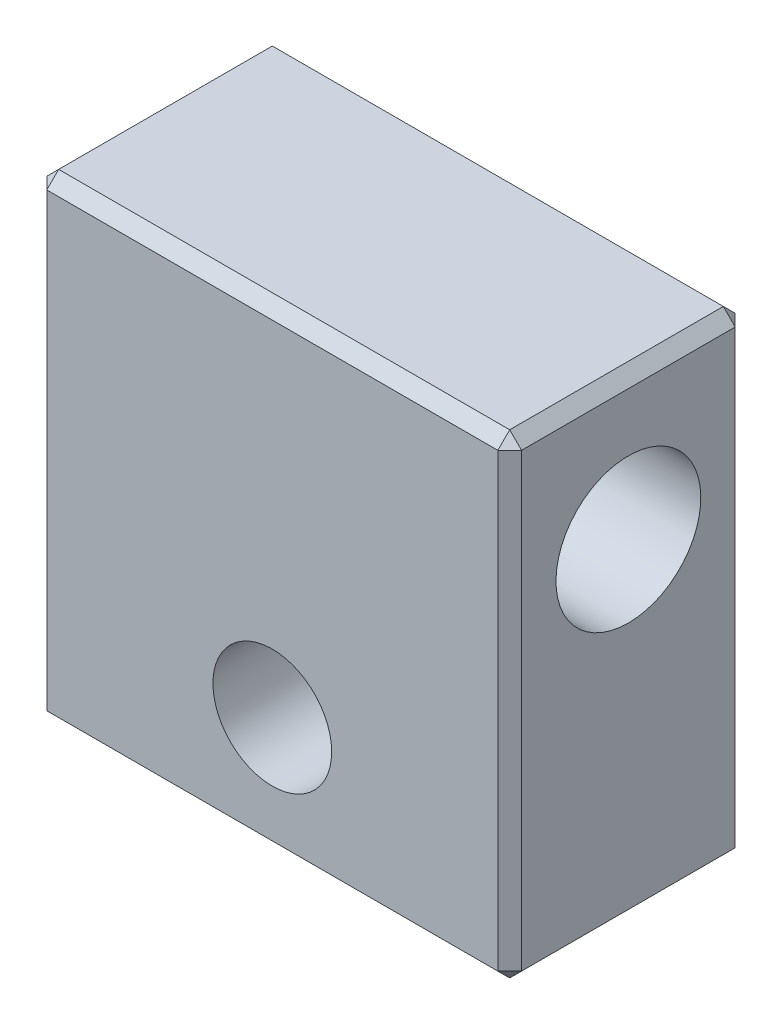
ISO-10303-21;
HEADER;
FILE_DESCRIPTION(('STEP AP214'),'2;1');
FILE_NAME('part.step','',(''),(''),'','','');
FILE_SCHEMA(('AUTOMOTIVE_DESIGN { 1 0 10303 214 1 1 1 1 }'));
ENDSEC;
DATA;
#1=APPLICATION_CONTEXT('core data for automotive mechanical design processes');
#2=APPLICATION_PROTOCOL_DEFINITION('international standard','automotive_design',2000,#1);
#3=PRODUCT_CONTEXT('',#1,'mechanical');
#4=PRODUCT('Part','Part','',(#3));
#5=PRODUCT_RELATED_PRODUCT_CATEGORY('part','',(#4));
#6=PRODUCT_DEFINITION_FORMATION('','',#4);
#7=PRODUCT_DEFINITION_CONTEXT('part definition',#1,'design');
#8=PRODUCT_DEFINITION('design','',#6,#7);
#9=PRODUCT_DEFINITION_SHAPE('','',#8);
#10=(LENGTH_UNIT() NAMED_UNIT(*) SI_UNIT(.MILLI.,.METRE.));
#11=(NAMED_UNIT(*) PLANE_ANGLE_UNIT() SI_UNIT($,.RADIAN.));
#12=(NAMED_UNIT(*) SI_UNIT($,.STERADIAN.) SOLID_ANGLE_UNIT());
#13=UNCERTAINTY_MEASURE_WITH_UNIT(LENGTH_MEASURE(1.E-05),#10,'distance_accuracy_value','');
#14=(GEOMETRIC_REPRESENTATION_CONTEXT(3) GLOBAL_UNCERTAINTY_ASSIGNED_CONTEXT((#13)) GLOBAL_UNIT_ASSIGNED_CONTEXT((#10,
#11,#12)) REPRESENTATION_CONTEXT('',''));
#15=CARTESIAN_POINT('',(0.,0.,0.));
#16=DIRECTION('',(0.,0.,1.));
#17=DIRECTION('',(1.,0.,0.));
#18=AXIS2_PLACEMENT_3D('',#15,#16,#17);
#19=CARTESIAN_POINT('',(10.003,9.497,9.5));
#20=DIRECTION('',(0.577350269189626,0.577350269189626,0.577350269189626));
#21=DIRECTION('',(-0.707106781186547,0.707106781186547,0.));
#22=AXIS2_PLACEMENT_3D('',#19,#20,#21);
#23=PLANE('',#22);
#24=DIRECTION('',(0.707106781186547,0.,-0.707106781186547));
#25=VECTOR('',#24,1.);
#26=CARTESIAN_POINT('',(9.75,9.5,9.75));
#27=LINE('',#26,#25);
#28=CARTESIAN_POINT('',(9.50000000003625,9.50000000017751,9.99999999978623));
#29=VERTEX_POINT('',#28);
#30=CARTESIAN_POINT('',(9.999999999938,9.500000000062,9.5));
#31=VERTEX_POINT('',#30);
#32=EDGE_CURVE('E388',#29,#31,#27,.T.);
#33=ORIENTED_EDGE('',*,*,#32,.T.);
#34=DIRECTION('',(-0.707106781186547,0.707106781186547,0.));
#35=VECTOR('',#34,1.);
#36=CARTESIAN_POINT('',(9.75,9.75,9.5));
#37=LINE('',#36,#35);
#38=CARTESIAN_POINT('',(9.500000000062,9.999999999938,9.5));
#39=VERTEX_POINT('',#38);
#40=EDGE_CURVE('E330',#31,#39,#37,.T.);
#41=ORIENTED_EDGE('',*,*,#40,.T.);
#42=DIRECTION('',(0.,-0.707106781186547,0.707106781186547));
#43=VECTOR('',#42,1.);
#44=CARTESIAN_POINT('',(9.5,9.75,9.75));
#45=LINE('',#44,#43);
#46=EDGE_CURVE('E393',#39,#29,#45,.T.);
#47=ORIENTED_EDGE('',*,*,#46,.T.);
#48=EDGE_LOOP('',(#33,#41,#47));
#49=FACE_BOUND('',#48,.T.);
#50=ADVANCED_FACE('F17',(#49),#23,.T.);
#51=CARTESIAN_POINT('',(9.497,-10.003,9.5));
#52=DIRECTION('',(0.577350269189626,-0.577350269189626,0.577350269189626));
#53=DIRECTION('',(0.707106781186547,0.707106781186547,0.));
#54=AXIS2_PLACEMENT_3D('',#51,#52,#53);
#55=PLANE('',#54);
#56=DIRECTION('',(0.,-0.707106781186547,-0.707106781186547));
#57=VECTOR('',#56,1.);
#58=CARTESIAN_POINT('',(9.5,-9.75,9.75));
#59=LINE('',#58,#57);
#60=CARTESIAN_POINT('',(9.50000000017751,-9.50000000003625,9.99999999978623));
#61=VERTEX_POINT('',#60);
#62=CARTESIAN_POINT('',(9.500000000062,-9.999999999938,9.5));
#63=VERTEX_POINT('',#62);
#64=EDGE_CURVE('E396',#61,#63,#59,.T.);
#65=ORIENTED_EDGE('',*,*,#64,.T.);
#66=DIRECTION('',(0.707106781186547,0.707106781186547,0.));
#67=VECTOR('',#66,1.);
#68=CARTESIAN_POINT('',(9.75,-9.75,9.5));
#69=LINE('',#68,#67);
#70=CARTESIAN_POINT('',(9.999999999938,-9.500000000062,9.5));
#71=VERTEX_POINT('',#70);
#72=EDGE_CURVE('E382',#63,#71,#69,.T.);
#73=ORIENTED_EDGE('',*,*,#72,.T.);
#74=DIRECTION('',(-0.707106781186547,0.,0.707106781186547));
#75=VECTOR('',#74,1.);
#76=CARTESIAN_POINT('',(9.75,-9.5,9.75));
#77=LINE('',#76,#75);
#78=EDGE_CURVE('E385',#71,#61,#77,.T.);
#79=ORIENTED_EDGE('',*,*,#78,.T.);
#80=EDGE_LOOP('',(#65,#73,#79));
#81=FACE_BOUND('',#80,.T.);
#82=ADVANCED_FACE('F209',(#81),#55,.T.);
#83=CARTESIAN_POINT('',(-9.497,10.003,9.5));
#84=DIRECTION('',(-0.577350269189626,0.577350269189626,0.577350269189626));
#85=DIRECTION('',(-0.707106781186547,-0.707106781186547,0.));
#86=AXIS2_PLACEMENT_3D('',#83,#84,#85);
#87=PLANE('',#86);
#88=DIRECTION('',(0.,0.707106781186547,-0.707106781186547));
#89=VECTOR('',#88,1.);
#90=CARTESIAN_POINT('',(-9.5,9.75,9.75));
#91=LINE('',#90,#89);
#92=CARTESIAN_POINT('',(-9.50000000017751,9.50000000003625,9.99999999978623));
#93=VERTEX_POINT('',#92);
#94=CARTESIAN_POINT('',(-9.500000000062,9.999999999938,9.5));
#95=VERTEX_POINT('',#94);
#96=EDGE_CURVE('E390',#93,#95,#91,.T.);
#97=ORIENTED_EDGE('',*,*,#96,.T.);
#98=DIRECTION('',(-0.707106781186547,-0.707106781186547,0.));
#99=VECTOR('',#98,1.);
#100=CARTESIAN_POINT('',(-9.75,9.75,9.5));
#101=LINE('',#100,#99);
#102=CARTESIAN_POINT('',(-9.999999999938,9.500000000062,9.5));
#103=VERTEX_POINT('',#102);
#104=EDGE_CURVE('E376',#95,#103,#101,.T.);
#105=ORIENTED_EDGE('',*,*,#104,.T.);
#106=DIRECTION('',(0.707106781186547,0.,0.707106781186547));
#107=VECTOR('',#106,1.);
#108=CARTESIAN_POINT('',(-9.75,9.5,9.75));
#109=LINE('',#108,#107);
#110=EDGE_CURVE('E373',#103,#93,#109,.T.);
#111=ORIENTED_EDGE('',*,*,#110,.T.);
#112=EDGE_LOOP('',(#97,#105,#111));
#113=FACE_BOUND('',#112,.T.);
#114=ADVANCED_FACE('F213',(#113),#87,.T.);
#115=CARTESIAN_POINT('',(-10.003,-9.497,9.5));
#116=DIRECTION('',(-0.577350269189626,-0.577350269189626,0.577350269189626));
#117=DIRECTION('',(0.707106781186547,-0.707106781186547,0.));
#118=AXIS2_PLACEMENT_3D('',#115,#116,#117);
#119=PLANE('',#118);
#120=DIRECTION('',(0.,0.707106781186547,0.707106781186547));
#121=VECTOR('',#120,1.);
#122=CARTESIAN_POINT('',(-9.5,-9.75,9.75));
#123=LINE('',#122,#121);
#124=CARTESIAN_POINT('',(-9.500000000062,-9.999999999938,9.5));
#125=VERTEX_POINT('',#124);
#126=CARTESIAN_POINT('',(-9.50000000003625,-9.50000000017751,9.99999999978623));
#127=VERTEX_POINT('',#126);
#128=EDGE_CURVE('E399',#125,#127,#123,.T.);
#129=ORIENTED_EDGE('',*,*,#128,.T.);
#130=DIRECTION('',(-0.707106781186547,0.,-0.707106781186547));
#131=VECTOR('',#130,1.);
#132=CARTESIAN_POINT('',(-9.75,-9.5,9.75));
#133=LINE('',#132,#131);
#134=CARTESIAN_POINT('',(-9.999999999938,-9.500000000062,9.5));
#135=VERTEX_POINT('',#134);
#136=EDGE_CURVE('E138',#127,#135,#133,.T.);
#137=ORIENTED_EDGE('',*,*,#136,.T.);
#138=DIRECTION('',(0.707106781186547,-0.707106781186547,0.));
#139=VECTOR('',#138,1.);
#140=CARTESIAN_POINT('',(-9.75,-9.75,9.5));
#141=LINE('',#140,#139);
#142=EDGE_CURVE('E379',#135,#125,#141,.T.);
#143=ORIENTED_EDGE('',*,*,#142,.T.);
#144=EDGE_LOOP('',(#129,#137,#143));
#145=FACE_BOUND('',#144,.T.);
#146=ADVANCED_FACE('F217',(#145),#119,.T.);
#147=CARTESIAN_POINT('',(-9.5,-9.5,10.));
#148=DIRECTION('',(0.,0.707106781186547,-0.707106781186547));
#149=DIRECTION('',(1.,0.,0.));
#150=AXIS2_PLACEMENT_3D('',#147,#148,#149);
#151=PLANE('',#150);
#152=DIRECTION('',(-1.,0.,0.));
#153=VECTOR('',#152,1.);
#154=CARTESIAN_POINT('',(0.,-9.5,10.));
#155=LINE('',#154,#153);
#156=EDGE_CURVE('E362',#61,#127,#155,.T.);
#157=ORIENTED_EDGE('',*,*,#156,.T.);
#158=ORIENTED_EDGE('',*,*,#128,.F.);
#159=DIRECTION('',(1.,0.,0.));
#160=VECTOR('',#159,1.);
#161=CARTESIAN_POINT('',(0.,-10.,9.5));
#162=LINE('',#161,#160);
#163=EDGE_CURVE('E176',#125,#63,#162,.T.);
#164=ORIENTED_EDGE('',*,*,#163,.T.);
#165=ORIENTED_EDGE('',*,*,#64,.F.);
#166=EDGE_LOOP('',(#157,#158,#164,#165));
#167=FACE_BOUND('',#166,.T.);
#168=ADVANCED_FACE('F221',(#167),#151,.F.);
#169=CARTESIAN_POINT('',(9.5,9.5,10.));
#170=DIRECTION('',(0.,-0.707106781186547,-0.707106781186547));
#171=DIRECTION('',(-1.,0.,0.));
#172=AXIS2_PLACEMENT_3D('',#169,#170,#171);
#173=PLANE('',#172);
#174=DIRECTION('',(1.,0.,0.));
#175=VECTOR('',#174,1.);
#176=CARTESIAN_POINT('',(0.,9.5,10.));
#177=LINE('',#176,#175);
#178=EDGE_CURVE('E356',#93,#29,#177,.T.);
#179=ORIENTED_EDGE('',*,*,#178,.T.);
#180=ORIENTED_EDGE('',*,*,#46,.F.);
#181=DIRECTION('',(-1.,0.,0.));
#182=VECTOR('',#181,1.);
#183=CARTESIAN_POINT('',(0.,10.,9.5));
#184=LINE('',#183,#182);
#185=EDGE_CURVE('E137',#39,#95,#184,.T.);
#186=ORIENTED_EDGE('',*,*,#185,.T.);
#187=ORIENTED_EDGE('',*,*,#96,.F.);
#188=EDGE_LOOP('',(#179,#180,#186,#187));
#189=FACE_BOUND('',#188,.T.);
#190=ADVANCED_FACE('F225',(#189),#173,.F.);
#191=CARTESIAN_POINT('',(9.5,-9.5,10.));
#192=DIRECTION('',(-0.707106781186547,0.,-0.707106781186547));
#193=DIRECTION('',(0.,1.,0.));
#194=AXIS2_PLACEMENT_3D('',#191,#192,#193);
#195=PLANE('',#194);
#196=DIRECTION('',(0.,1.,0.));
#197=VECTOR('',#196,1.);
#198=CARTESIAN_POINT('',(10.,0.,9.5));
#199=LINE('',#198,#197);
#200=EDGE_CURVE('E163',#71,#31,#199,.T.);
#201=ORIENTED_EDGE('',*,*,#200,.T.);
#202=ORIENTED_EDGE('',*,*,#32,.F.);
#203=DIRECTION('',(0.,-1.,0.));
#204=VECTOR('',#203,1.);
#205=CARTESIAN_POINT('',(9.5,0.,10.));
#206=LINE('',#205,#204);
#207=EDGE_CURVE('E321',#29,#61,#206,.T.);
#208=ORIENTED_EDGE('',*,*,#207,.T.);
#209=ORIENTED_EDGE('',*,*,#78,.F.);
#210=EDGE_LOOP('',(#201,#202,#208,#209));
#211=FACE_BOUND('',#210,.T.);
#212=ADVANCED_FACE('F229',(#211),#195,.F.);
#213=CARTESIAN_POINT('',(9.5,10.,9.5));
#214=DIRECTION('',(-0.707106781186547,-0.707106781186547,0.));
#215=DIRECTION('',(0.,0.,-1.));
#216=AXIS2_PLACEMENT_3D('',#213,#214,#215);
#217=PLANE('',#216);
#218=DIRECTION('',(0.,0.,-1.));
#219=VECTOR('',#218,1.);
#220=CARTESIAN_POINT('',(10.,9.5,5.));
#221=LINE('',#220,#219);
#222=CARTESIAN_POINT('',(9.999999999938,9.499999999938,0.499999999907));
#223=VERTEX_POINT('',#222);
#224=EDGE_CURVE('E159',#31,#223,#221,.T.);
#225=ORIENTED_EDGE('',*,*,#224,.T.);
#226=DIRECTION('',(0.707106781150132,-0.707106781222963,-7.28311306586487E-11));
#227=VECTOR('',#226,1.);
#228=CARTESIAN_POINT('',(9.5000000000725,9.999999999855,0.4999999999275));
#229=LINE('',#228,#227);
#230=CARTESIAN_POINT('',(9.49999999996375,9.99999999996375,0.499999999945625));
#231=VERTEX_POINT('',#230);
#232=EDGE_CURVE('E153',#231,#223,#229,.T.);
#233=ORIENTED_EDGE('',*,*,#232,.F.);
#234=DIRECTION('',(0.,0.,1.));
#235=VECTOR('',#234,1.);
#236=CARTESIAN_POINT('',(9.5,10.,5.));
#237=LINE('',#236,#235);
#238=EDGE_CURVE('E149',#231,#39,#237,.T.);
#239=ORIENTED_EDGE('',*,*,#238,.T.);
#240=ORIENTED_EDGE('',*,*,#40,.F.);
#241=EDGE_LOOP('',(#225,#233,#239,#240));
#242=FACE_BOUND('',#241,.T.);
#243=ADVANCED_FACE('F233',(#242),#217,.F.);
#244=CARTESIAN_POINT('',(10.,-9.5,9.5));
#245=DIRECTION('',(-0.707106781186547,0.707106781186547,0.));
#246=DIRECTION('',(0.,0.,-1.));
#247=AXIS2_PLACEMENT_3D('',#244,#245,#246);
#248=PLANE('',#247);
#249=DIRECTION('',(0.,0.,-1.));
#250=VECTOR('',#249,1.);
#251=CARTESIAN_POINT('',(9.5,-10.,5.));
#252=LINE('',#251,#250);
#253=CARTESIAN_POINT('',(9.49999999996375,-9.99999999996375,0.499999999945625));
#254=VERTEX_POINT('',#253);
#255=EDGE_CURVE('E172',#63,#254,#252,.T.);
#256=ORIENTED_EDGE('',*,*,#255,.T.);
#257=DIRECTION('',(-0.707106781150131,-0.707106781222964,7.28323572933826E-11));
#258=VECTOR('',#257,1.);
#259=CARTESIAN_POINT('',(9.999999999876,-9.5,0.499999999876));
#260=LINE('',#259,#258);
#261=CARTESIAN_POINT('',(9.999999999938,-9.499999999938,0.499999999907));
#262=VERTEX_POINT('',#261);
#263=EDGE_CURVE('E322',#262,#254,#260,.T.);
#264=ORIENTED_EDGE('',*,*,#263,.F.);
#265=DIRECTION('',(0.,0.,1.));
#266=VECTOR('',#265,1.);
#267=CARTESIAN_POINT('',(10.,-9.5,5.));
#268=LINE('',#267,#266);
#269=EDGE_CURVE('E162',#262,#71,#268,.T.);
#270=ORIENTED_EDGE('',*,*,#269,.T.);
#271=ORIENTED_EDGE('',*,*,#72,.F.);
#272=EDGE_LOOP('',(#256,#264,#270,#271));
#273=FACE_BOUND('',#272,.T.);
#274=ADVANCED_FACE('F237',(#273),#248,.F.);
#275=CARTESIAN_POINT('',(-9.5,-10.,9.5));
#276=DIRECTION('',(0.707106781186547,0.707106781186547,0.));
#277=DIRECTION('',(0.,0.,-1.));
#278=AXIS2_PLACEMENT_3D('',#275,#276,#277);
#279=PLANE('',#278);
#280=DIRECTION('',(0.,0.,-1.));
#281=VECTOR('',#280,1.);
#282=CARTESIAN_POINT('',(-10.,-9.5,5.));
#283=LINE('',#282,#281);
#284=CARTESIAN_POINT('',(-9.999999999938,-9.499999999938,0.499999999907));
#285=VERTEX_POINT('',#284);
#286=EDGE_CURVE('E115',#135,#285,#283,.T.);
#287=ORIENTED_EDGE('',*,*,#286,.T.);
#288=DIRECTION('',(-0.707106781150131,0.707106781222964,-7.28323572933826E-11));
#289=VECTOR('',#288,1.);
#290=CARTESIAN_POINT('',(-9.5000000000725,-9.999999999855,0.4999999999275));
#291=LINE('',#290,#289);
#292=CARTESIAN_POINT('',(-9.49999999996375,-9.99999999996375,0.499999999945625));
#293=VERTEX_POINT('',#292);
#294=EDGE_CURVE('E182',#293,#285,#291,.T.);
#295=ORIENTED_EDGE('',*,*,#294,.F.);
#296=DIRECTION('',(0.,0.,1.));
#297=VECTOR('',#296,1.);
#298=CARTESIAN_POINT('',(-9.5,-10.,5.));
#299=LINE('',#298,#297);
#300=EDGE_CURVE('E175',#293,#125,#299,.T.);
#301=ORIENTED_EDGE('',*,*,#300,.T.);
#302=ORIENTED_EDGE('',*,*,#142,.F.);
#303=EDGE_LOOP('',(#287,#295,#301,#302));
#304=FACE_BOUND('',#303,.T.);
#305=ADVANCED_FACE('F241',(#304),#279,.F.);
#306=CARTESIAN_POINT('',(-10.,9.5,9.5));
#307=DIRECTION('',(0.707106781186547,-0.707106781186547,0.));
#308=DIRECTION('',(0.,0.,-1.));
#309=AXIS2_PLACEMENT_3D('',#306,#307,#308);
#310=PLANE('',#309);
#311=DIRECTION('',(0.,0.,-1.));
#312=VECTOR('',#311,1.);
#313=CARTESIAN_POINT('',(-9.5,10.,5.));
#314=LINE('',#313,#312);
#315=CARTESIAN_POINT('',(-9.499999999938,9.999999999938,0.499999999907));
#316=VERTEX_POINT('',#315);
#317=EDGE_CURVE('E132',#95,#316,#314,.T.);
#318=ORIENTED_EDGE('',*,*,#317,.T.);
#319=DIRECTION('',(0.707106781222964,0.707106781150131,-7.28323572933826E-11));
#320=VECTOR('',#319,1.);
#321=CARTESIAN_POINT('',(-9.999999999855,9.5000000000725,0.4999999999275));
#322=LINE('',#321,#320);
#323=CARTESIAN_POINT('',(-9.99999999996375,9.49999999996375,0.499999999945625));
#324=VERTEX_POINT('',#323);
#325=EDGE_CURVE('E21',#324,#316,#322,.T.);
#326=ORIENTED_EDGE('',*,*,#325,.F.);
#327=DIRECTION('',(0.,0.,1.));
#328=VECTOR('',#327,1.);
#329=CARTESIAN_POINT('',(-10.,9.5,5.));
#330=LINE('',#329,#328);
#331=EDGE_CURVE('E106',#324,#103,#330,.T.);
#332=ORIENTED_EDGE('',*,*,#331,.T.);
#333=ORIENTED_EDGE('',*,*,#104,.F.);
#334=EDGE_LOOP('',(#318,#326,#332,#333));
#335=FACE_BOUND('',#334,.T.);
#336=ADVANCED_FACE('F130',(#335),#310,.F.);
#337=CARTESIAN_POINT('',(-9.5,9.5,10.));
#338=DIRECTION('',(0.707106781186547,0.,-0.707106781186547));
#339=DIRECTION('',(0.,-1.,0.));
#340=AXIS2_PLACEMENT_3D('',#337,#338,#339);
#341=PLANE('',#340);
#342=DIRECTION('',(0.,1.,0.));
#343=VECTOR('',#342,1.);
#344=CARTESIAN_POINT('',(-9.5,0.,10.));
#345=LINE('',#344,#343);
#346=EDGE_CURVE('E359',#127,#93,#345,.T.);
#347=ORIENTED_EDGE('',*,*,#346,.T.);
#348=ORIENTED_EDGE('',*,*,#110,.F.);
#349=DIRECTION('',(0.,-1.,0.));
#350=VECTOR('',#349,1.);
#351=CARTESIAN_POINT('',(-10.,0.,9.5));
#352=LINE('',#351,#350);
#353=EDGE_CURVE('E112',#103,#135,#352,.T.);
#354=ORIENTED_EDGE('',*,*,#353,.T.);
#355=ORIENTED_EDGE('',*,*,#136,.F.);
#356=EDGE_LOOP('',(#347,#348,#354,#355));
#357=FACE_BOUND('',#356,.T.);
#358=ADVANCED_FACE('F248',(#357),#341,.F.);
#359=CARTESIAN_POINT('',(-10.003,9.2455,0.2485));
#360=DIRECTION('',(-0.577350269189626,0.577350269189626,-0.577350269189626));
#361=DIRECTION('',(0.,0.707106781186547,0.707106781186548));
#362=AXIS2_PLACEMENT_3D('',#359,#360,#361);
#363=PLANE('',#362);
#364=ORIENTED_EDGE('',*,*,#325,.T.);
#365=DIRECTION('',(0.,0.707106781186548,0.707106781186547));
#366=VECTOR('',#365,1.);
#367=CARTESIAN_POINT('',(-9.5,9.75,0.25));
#368=LINE('',#367,#366);
#369=CARTESIAN_POINT('',(-9.5,9.500000000062,6.19999995896299E-11));
#370=VERTEX_POINT('',#369);
#371=EDGE_CURVE('E140',#370,#316,#368,.T.);
#372=ORIENTED_EDGE('',*,*,#371,.F.);
#373=DIRECTION('',(0.707106781186548,0.,-0.707106781186547));
#374=VECTOR('',#373,1.);
#375=CARTESIAN_POINT('',(-9.75,9.5,0.25));
#376=LINE('',#375,#374);
#377=EDGE_CURVE('E122',#324,#370,#376,.T.);
#378=ORIENTED_EDGE('',*,*,#377,.F.);
#379=EDGE_LOOP('',(#364,#372,#378));
#380=FACE_BOUND('',#379,.T.);
#381=ADVANCED_FACE('F139',(#380),#363,.T.);
#382=CARTESIAN_POINT('',(-9.5,10.,9.5));
#383=DIRECTION('',(0.,-1.,0.));
#384=DIRECTION('',(0.,0.,-1.));
#385=AXIS2_PLACEMENT_3D('',#382,#383,#384);
#386=PLANE('',#385);
#387=DIRECTION('',(1.,0.,0.));
#388=VECTOR('',#387,1.);
#389=CARTESIAN_POINT('',(0.,10.,0.5));
#390=LINE('',#389,#388);
#391=EDGE_CURVE('E147',#316,#231,#390,.T.);
#392=ORIENTED_EDGE('',*,*,#391,.F.);
#393=ORIENTED_EDGE('',*,*,#317,.F.);
#394=ORIENTED_EDGE('',*,*,#185,.F.);
#395=ORIENTED_EDGE('',*,*,#238,.F.);
#396=EDGE_LOOP('',(#392,#393,#394,#395));
#397=FACE_BOUND('',#396,.T.);
#398=ADVANCED_FACE('F254',(#397),#386,.F.);
#399=CARTESIAN_POINT('',(10.003,9.5,0.503));
#400=DIRECTION('',(0.577350269189626,0.577350269189626,-0.577350269189626));
#401=DIRECTION('',(-0.707106781186547,0.,-0.707106781186548));
#402=AXIS2_PLACEMENT_3D('',#399,#400,#401);
#403=PLANE('',#402);
#404=DIRECTION('',(0.707106781186548,0.,0.707106781186547));
#405=VECTOR('',#404,1.);
#406=CARTESIAN_POINT('',(9.75,9.5,0.25));
#407=LINE('',#406,#405);
#408=CARTESIAN_POINT('',(9.500000000062,9.5,6.19999951427069E-11));
#409=VERTEX_POINT('',#408);
#410=EDGE_CURVE('E155',#409,#223,#407,.T.);
#411=ORIENTED_EDGE('',*,*,#410,.F.);
#412=DIRECTION('',(0.,-0.707106781186548,-0.707106781186547));
#413=VECTOR('',#412,1.);
#414=CARTESIAN_POINT('',(9.5,9.75,0.25));
#415=LINE('',#414,#413);
#416=EDGE_CURVE('E142',#231,#409,#415,.T.);
#417=ORIENTED_EDGE('',*,*,#416,.F.);
#418=ORIENTED_EDGE('',*,*,#232,.T.);
#419=EDGE_LOOP('',(#411,#417,#418));
#420=FACE_BOUND('',#419,.T.);
#421=ADVANCED_FACE('F257',(#420),#403,.T.);
#422=CARTESIAN_POINT('',(9.7515,-10.003,0.7545));
#423=DIRECTION('',(0.577350269189626,-0.577350269189626,-0.577350269189626));
#424=DIRECTION('',(-0.707106781186547,0.,-0.707106781186548));
#425=AXIS2_PLACEMENT_3D('',#422,#423,#424);
#426=PLANE('',#425);
#427=DIRECTION('',(0.,-0.707106781186548,0.707106781186547));
#428=VECTOR('',#427,1.);
#429=CARTESIAN_POINT('',(9.5,-9.75,0.25));
#430=LINE('',#429,#428);
#431=CARTESIAN_POINT('',(9.500000000062,-9.5,6.19999951427069E-11));
#432=VERTEX_POINT('',#431);
#433=EDGE_CURVE('E165',#432,#254,#430,.T.);
#434=ORIENTED_EDGE('',*,*,#433,.F.);
#435=DIRECTION('',(-0.707106781186548,0.,-0.707106781186547));
#436=VECTOR('',#435,1.);
#437=CARTESIAN_POINT('',(9.75,-9.5,0.25));
#438=LINE('',#437,#436);
#439=EDGE_CURVE('E36',#262,#432,#438,.T.);
#440=ORIENTED_EDGE('',*,*,#439,.F.);
#441=ORIENTED_EDGE('',*,*,#263,.T.);
#442=EDGE_LOOP('',(#434,#440,#441));
#443=FACE_BOUND('',#442,.T.);
#444=ADVANCED_FACE('F261',(#443),#426,.T.);
#445=CARTESIAN_POINT('',(-9.5,-10.,0.5));
#446=DIRECTION('',(0.,1.,0.));
#447=DIRECTION('',(0.,0.,1.));
#448=AXIS2_PLACEMENT_3D('',#445,#446,#447);
#449=PLANE('',#448);
#450=DIRECTION('',(-1.,0.,0.));
#451=VECTOR('',#450,1.);
#452=CARTESIAN_POINT('',(0.,-10.,0.5));
#453=LINE('',#452,#451);
#454=EDGE_CURVE('E171',#254,#293,#453,.T.);
#455=ORIENTED_EDGE('',*,*,#454,.F.);
#456=ORIENTED_EDGE('',*,*,#255,.F.);
#457=ORIENTED_EDGE('',*,*,#163,.F.);
#458=ORIENTED_EDGE('',*,*,#300,.F.);
#459=EDGE_LOOP('',(#455,#456,#457,#458));
#460=FACE_BOUND('',#459,.T.);
#461=ADVANCED_FACE('F265',(#460),#449,.F.);
#462=CARTESIAN_POINT('',(-9.2455,-10.003,0.2485));
#463=DIRECTION('',(-0.577350269189626,-0.577350269189626,-0.577350269189626));
#464=DIRECTION('',(-0.707106781186547,0.,0.707106781186548));
#465=AXIS2_PLACEMENT_3D('',#462,#463,#464);
#466=PLANE('',#465);
#467=ORIENTED_EDGE('',*,*,#294,.T.);
#468=DIRECTION('',(-0.707106781186548,0.,0.707106781186547));
#469=VECTOR('',#468,1.);
#470=CARTESIAN_POINT('',(-9.75,-9.5,0.25));
#471=LINE('',#470,#469);
#472=CARTESIAN_POINT('',(-9.500000000062,-9.5,6.19999995896299E-11));
#473=VERTEX_POINT('',#472);
#474=EDGE_CURVE('E125',#473,#285,#471,.T.);
#475=ORIENTED_EDGE('',*,*,#474,.F.);
#476=DIRECTION('',(0.,0.707106781186548,-0.707106781186547));
#477=VECTOR('',#476,1.);
#478=CARTESIAN_POINT('',(-9.5,-9.75,0.25));
#479=LINE('',#478,#477);
#480=EDGE_CURVE('E179',#293,#473,#479,.T.);
#481=ORIENTED_EDGE('',*,*,#480,.F.);
#482=EDGE_LOOP('',(#467,#475,#481));
#483=FACE_BOUND('',#482,.T.);
#484=ADVANCED_FACE('F269',(#483),#466,.T.);
#485=CARTESIAN_POINT('',(9.5,-9.5,10.));
#486=DIRECTION('',(0.,0.,-1.));
#487=DIRECTION('',(-1.,0.,0.));
#488=AXIS2_PLACEMENT_3D('',#485,#486,#487);
#489=PLANE('',#488);
#490=CARTESIAN_POINT('',(0.,-5.,10.));
#491=DIRECTION('',(0.,0.,1.));
#492=DIRECTION('',(1.,0.,0.));
#493=AXIS2_PLACEMENT_3D('',#490,#491,#492);
#494=CIRCLE('',#493,2.5);
#495=CARTESIAN_POINT('',(2.5,-5.,10.));
#496=VERTEX_POINT('',#495);
#497=EDGE_CURVE('E184',#496,#496,#494,.T.);
#498=ORIENTED_EDGE('',*,*,#497,.F.);
#499=EDGE_LOOP('',(#498));
#500=FACE_BOUND('',#499,.T.);
#501=ORIENTED_EDGE('',*,*,#346,.F.);
#502=ORIENTED_EDGE('',*,*,#156,.F.);
#503=ORIENTED_EDGE('',*,*,#207,.F.);
#504=ORIENTED_EDGE('',*,*,#178,.F.);
#505=EDGE_LOOP('',(#501,#502,#503,#504));
#506=FACE_BOUND('',#505,.T.);
#507=ADVANCED_FACE('F273',(#500,#506),#489,.F.);
#508=CARTESIAN_POINT('',(10.,-9.5,0.5));
#509=DIRECTION('',(-1.,0.,0.));
#510=DIRECTION('',(0.,0.,1.));
#511=AXIS2_PLACEMENT_3D('',#508,#509,#510);
#512=PLANE('',#511);
#513=CARTESIAN_POINT('',(10.,4.,5.));
#514=DIRECTION('',(-1.,0.,0.));
#515=DIRECTION('',(0.,-1.,0.));
#516=AXIS2_PLACEMENT_3D('',#513,#514,#515);
#517=CIRCLE('',#516,3.05);
#518=CARTESIAN_POINT('',(10.,0.949999999999999,5.));
#519=VERTEX_POINT('',#518);
#520=EDGE_CURVE('E314',#519,#519,#517,.F.);
#521=ORIENTED_EDGE('',*,*,#520,.F.);
#522=EDGE_LOOP('',(#521));
#523=FACE_BOUND('',#522,.T.);
#524=DIRECTION('',(0.,-1.,0.));
#525=VECTOR('',#524,1.);
#526=CARTESIAN_POINT('',(10.,0.,0.5));
#527=LINE('',#526,#525);
#528=EDGE_CURVE('E158',#223,#262,#527,.T.);
#529=ORIENTED_EDGE('',*,*,#528,.F.);
#530=ORIENTED_EDGE('',*,*,#224,.F.);
#531=ORIENTED_EDGE('',*,*,#200,.F.);
#532=ORIENTED_EDGE('',*,*,#269,.F.);
#533=EDGE_LOOP('',(#529,#530,#531,#532));
#534=FACE_BOUND('',#533,.T.);
#535=ADVANCED_FACE('F277',(#523,#534),#512,.F.);
#536=CARTESIAN_POINT('',(-10.,-9.5,9.5));
#537=DIRECTION('',(1.,0.,0.));
#538=DIRECTION('',(0.,0.,-1.));
#539=AXIS2_PLACEMENT_3D('',#536,#537,#538);
#540=PLANE('',#539);
#541=CARTESIAN_POINT('',(-10.,3.99999999999999,5.));
#542=DIRECTION('',(-1.,0.,0.));
#543=DIRECTION('',(0.,-1.,0.));
#544=AXIS2_PLACEMENT_3D('',#541,#542,#543);
#545=CIRCLE('',#544,3.05);
#546=CARTESIAN_POINT('',(-10.,0.949999999999993,5.));
#547=VERTEX_POINT('',#546);
#548=EDGE_CURVE('E311',#547,#547,#545,.T.);
#549=ORIENTED_EDGE('',*,*,#548,.F.);
#550=EDGE_LOOP('',(#549));
#551=FACE_BOUND('',#550,.T.);
#552=ORIENTED_EDGE('',*,*,#331,.F.);
#553=DIRECTION('',(0.,1.,0.));
#554=VECTOR('',#553,1.);
#555=CARTESIAN_POINT('',(-10.,0.,0.5));
#556=LINE('',#555,#554);
#557=EDGE_CURVE('E110',#285,#324,#556,.T.);
#558=ORIENTED_EDGE('',*,*,#557,.F.);
#559=ORIENTED_EDGE('',*,*,#286,.F.);
#560=ORIENTED_EDGE('',*,*,#353,.F.);
#561=EDGE_LOOP('',(#552,#558,#559,#560));
#562=FACE_BOUND('',#561,.T.);
#563=ADVANCED_FACE('F108',(#551,#562),#540,.F.);
#564=CARTESIAN_POINT('',(-10.,-9.5,0.5));
#565=DIRECTION('',(-0.707106781186547,0.,-0.707106781186548));
#566=DIRECTION('',(0.,1.,0.));
#567=AXIS2_PLACEMENT_3D('',#564,#565,#566);
#568=PLANE('',#567);
#569=ORIENTED_EDGE('',*,*,#377,.T.);
#570=DIRECTION('',(0.,1.,0.));
#571=VECTOR('',#570,1.);
#572=CARTESIAN_POINT('',(-9.5,0.,0.));
#573=LINE('',#572,#571);
#574=EDGE_CURVE('E316',#473,#370,#573,.T.);
#575=ORIENTED_EDGE('',*,*,#574,.F.);
#576=ORIENTED_EDGE('',*,*,#474,.T.);
#577=ORIENTED_EDGE('',*,*,#557,.T.);
#578=EDGE_LOOP('',(#569,#575,#576,#577));
#579=FACE_BOUND('',#578,.T.);
#580=ADVANCED_FACE('F119',(#579),#568,.T.);
#581=CARTESIAN_POINT('',(-9.5,10.,0.5));
#582=DIRECTION('',(0.,0.707106781186547,-0.707106781186548));
#583=DIRECTION('',(1.,0.,0.));
#584=AXIS2_PLACEMENT_3D('',#581,#582,#583);
#585=PLANE('',#584);
#586=ORIENTED_EDGE('',*,*,#371,.T.);
#587=ORIENTED_EDGE('',*,*,#391,.T.);
#588=ORIENTED_EDGE('',*,*,#416,.T.);
#589=DIRECTION('',(1.,0.,0.));
#590=VECTOR('',#589,1.);
#591=CARTESIAN_POINT('',(0.,9.5,0.));
#592=LINE('',#591,#590);
#593=EDGE_CURVE('E348',#370,#409,#592,.T.);
#594=ORIENTED_EDGE('',*,*,#593,.F.);
#595=EDGE_LOOP('',(#586,#587,#588,#594));
#596=FACE_BOUND('',#595,.T.);
#597=ADVANCED_FACE('F287',(#596),#585,.T.);
#598=CARTESIAN_POINT('',(10.,9.5,0.5));
#599=DIRECTION('',(0.707106781186547,0.,-0.707106781186548));
#600=DIRECTION('',(0.,-1.,0.));
#601=AXIS2_PLACEMENT_3D('',#598,#599,#600);
#602=PLANE('',#601);
#603=ORIENTED_EDGE('',*,*,#410,.T.);
#604=ORIENTED_EDGE('',*,*,#528,.T.);
#605=ORIENTED_EDGE('',*,*,#439,.T.);
#606=DIRECTION('',(0.,-1.,0.));
#607=VECTOR('',#606,1.);
#608=CARTESIAN_POINT('',(9.5,0.,0.));
#609=LINE('',#608,#607);
#610=EDGE_CURVE('E327',#409,#432,#609,.T.);
#611=ORIENTED_EDGE('',*,*,#610,.F.);
#612=EDGE_LOOP('',(#603,#604,#605,#611));
#613=FACE_BOUND('',#612,.T.);
#614=ADVANCED_FACE('F290',(#613),#602,.T.);
#615=CARTESIAN_POINT('',(9.5,-10.,0.5));
#616=DIRECTION('',(0.,-0.707106781186547,-0.707106781186548));
#617=DIRECTION('',(-1.,0.,0.));
#618=AXIS2_PLACEMENT_3D('',#615,#616,#617);
#619=PLANE('',#618);
#620=ORIENTED_EDGE('',*,*,#480,.T.);
#621=DIRECTION('',(-1.,0.,0.));
#622=VECTOR('',#621,1.);
#623=CARTESIAN_POINT('',(0.,-9.5,0.));
#624=LINE('',#623,#622);
#625=EDGE_CURVE('E343',#432,#473,#624,.T.);
#626=ORIENTED_EDGE('',*,*,#625,.F.);
#627=ORIENTED_EDGE('',*,*,#433,.T.);
#628=ORIENTED_EDGE('',*,*,#454,.T.);
#629=EDGE_LOOP('',(#620,#626,#627,#628));
#630=FACE_BOUND('',#629,.T.);
#631=ADVANCED_FACE('F205',(#630),#619,.T.);
#632=CARTESIAN_POINT('',(0.,-5.,0.));
#633=DIRECTION('',(0.,0.,1.));
#634=DIRECTION('',(1.,0.,0.));
#635=AXIS2_PLACEMENT_3D('',#632,#633,#634);
#636=CYLINDRICAL_SURFACE('',#635,2.5);
#637=CARTESIAN_POINT('',(0.,-5.,0.));
#638=DIRECTION('',(0.,0.,1.));
#639=DIRECTION('',(1.,0.,0.));
#640=AXIS2_PLACEMENT_3D('',#637,#638,#639);
#641=CIRCLE('',#640,2.5);
#642=CARTESIAN_POINT('',(2.5,-5.,0.));
#643=VERTEX_POINT('',#642);
#644=EDGE_CURVE('E193',#643,#643,#641,.T.);
#645=ORIENTED_EDGE('',*,*,#644,.F.);
#646=EDGE_LOOP('',(#645));
#647=FACE_BOUND('',#646,.T.);
#648=ORIENTED_EDGE('',*,*,#497,.T.);
#649=EDGE_LOOP('',(#648));
#650=FACE_BOUND('',#649,.T.);
#651=ADVANCED_FACE('F201',(#647,#650),#636,.F.);
#652=CARTESIAN_POINT('',(10.,4.,5.));
#653=DIRECTION('',(-1.,0.,0.));
#654=DIRECTION('',(0.,-1.,0.));
#655=AXIS2_PLACEMENT_3D('',#652,#653,#654);
#656=CYLINDRICAL_SURFACE('',#655,3.05);
#657=CARTESIAN_POINT('',(-1.25000000008973,3.99999999971665,1.94999999991027));
#658=CARTESIAN_POINT('',(-1.2499960983994,3.93287575896056,1.95000313107347));
#659=CARTESIAN_POINT('',(-1.24456675899133,3.8656946739199,1.95223917805651));
#660=CARTESIAN_POINT('',(-1.22306110162237,3.73329064792972,1.96095646569729));
#661=CARTESIAN_POINT('',(-1.20696990572324,3.66807057658683,1.9674436383897));
#662=CARTESIAN_POINT('',(-1.16482959167411,3.54163379391086,1.98396703481426));
#663=CARTESIAN_POINT('',(-1.13880906466323,3.48040617371691,1.99399306238389));
#664=CARTESIAN_POINT('',(-1.07767504570607,3.36322096751251,2.01661616629186));
#665=CARTESIAN_POINT('',(-1.04256153326154,3.30726339338268,2.02921324842611));
#666=CARTESIAN_POINT('',(-0.962432076658229,3.19941507826607,2.05639778864283));
#667=CARTESIAN_POINT('',(-0.917044743776417,3.14781647396986,2.07104890693625));
#668=CARTESIAN_POINT('',(-0.818443713210699,3.05271698894961,2.10040751973668));
#669=CARTESIAN_POINT('',(-0.765226622709821,3.00921963729584,2.11511503597782));
#670=CARTESIAN_POINT('',(-0.649422479168207,2.9295238974076,2.14369815992849));
#671=CARTESIAN_POINT('',(-0.586511412063349,2.89376774241303,2.15750157647514));
#672=CARTESIAN_POINT('',(-0.454918124798308,2.83347522573678,2.18170559312021));
#673=CARTESIAN_POINT('',(-0.386238726041424,2.80893341629889,2.19210784475199));
#674=CARTESIAN_POINT('',(-0.248428864214846,2.77296630617594,2.20764291828713));
#675=CARTESIAN_POINT('',(-0.179471537973437,2.76097839198618,2.21300056394896));
#676=CARTESIAN_POINT('',(-0.0403319218250361,2.74870306513232,2.21848854444621));
#677=CARTESIAN_POINT('',(0.0298497049099694,2.74840950346274,2.21862162640804));
#678=CARTESIAN_POINT('',(0.163925868611096,2.75910645875794,2.21383631122419));
#679=CARTESIAN_POINT('',(0.227902526760074,2.76926684366201,2.2092895255172));
#680=CARTESIAN_POINT('',(0.353147219730641,2.79919430352711,2.19628299559245));
#681=CARTESIAN_POINT('',(0.414414750240117,2.81896315898821,2.18782252616258));
#682=CARTESIAN_POINT('',(0.534022594277051,2.86792886901991,2.16775264729355));
#683=CARTESIAN_POINT('',(0.59227466392889,2.89731460771897,2.15608096653691));
#684=CARTESIAN_POINT('',(0.703240145946157,2.96454569159146,2.13091994200194));
#685=CARTESIAN_POINT('',(0.755951618492644,3.00239398518355,2.11742996536764));
#686=CARTESIAN_POINT('',(0.858857547180559,3.08909380134206,2.08881535531175));
#687=CARTESIAN_POINT('',(0.908498059262854,3.13859011593802,2.07364703449589));
#688=CARTESIAN_POINT('',(0.998970434340392,3.24537648523135,2.04430943844051));
#689=CARTESIAN_POINT('',(1.03979792869639,3.30267038237517,2.03014066100953));
#690=CARTESIAN_POINT('',(1.11226662837174,3.42507941163519,2.00400808228582));
#691=CARTESIAN_POINT('',(1.14368284132497,3.49034038666224,1.99210045543149));
#692=CARTESIAN_POINT('',(1.19485229386658,3.62577415996539,1.97227641061698));
#693=CARTESIAN_POINT('',(1.21462884413258,3.6959368240468,1.96435202013515));
#694=CARTESIAN_POINT('',(1.23541531631987,3.80565122094457,1.95595449481816));
#695=CARTESIAN_POINT('',(1.24087540504368,3.84427799153541,1.95373000635944));
#696=CARTESIAN_POINT('',(1.24816885806095,3.92193010030554,1.95075185784842));
#697=CARTESIAN_POINT('',(1.25000226950769,3.96095543329618,1.94999817867298));
#698=CARTESIAN_POINT('',(1.24999609833081,4.06712424013595,1.95000313117049));
#699=CARTESIAN_POINT('',(1.24456675905711,4.1343053251756,1.95223917804802));
#700=CARTESIAN_POINT('',(1.22306110185141,4.26670935116081,1.96095646558623));
#701=CARTESIAN_POINT('',(1.20696990598205,4.33192942249997,1.96744363828132));
#702=CARTESIAN_POINT('',(1.16482959202055,4.45836620518596,1.98396703468529));
#703=CARTESIAN_POINT('',(1.13880906506647,4.51959382539326,1.99399306223207));
#704=CARTESIAN_POINT('',(1.07767504621119,4.63677903163622,2.01661616610754));
#705=CARTESIAN_POINT('',(1.04256153381106,4.69273660579088,2.02921324823232));
#706=CARTESIAN_POINT('',(0.962432077300318,4.80058492096042,2.05639778843269));
#707=CARTESIAN_POINT('',(0.917044744467302,4.8521835252856,2.07104890671927));
#708=CARTESIAN_POINT('',(0.818443713997225,4.94728301037006,2.10040751951374));
#709=CARTESIAN_POINT('',(0.765226623543435,4.99078036205934,2.11511503575575));
#710=CARTESIAN_POINT('',(0.64942248008433,5.07047610203639,2.14369815971943));
#711=CARTESIAN_POINT('',(0.586511413013448,5.10623225708295,2.15750157627835));
#712=CARTESIAN_POINT('',(0.454918125807047,5.16652477386965,2.18170559295663));
#713=CARTESIAN_POINT('',(0.386238727074755,5.19106658336586,2.19210784460932));
#714=CARTESIAN_POINT('',(0.248428865269544,5.22703369361126,2.20764291819317));
#715=CARTESIAN_POINT('',(0.179471539024644,5.2390216078624,2.21300056388149));
#716=CARTESIAN_POINT('',(0.040331922857256,5.25129693483522,2.21848854443145));
#717=CARTESIAN_POINT('',(-0.0298497038932352,5.25159049656242,2.2186216264195));
#718=CARTESIAN_POINT('',(-0.163925867626206,5.24089354137253,2.21383631128242));
#719=CARTESIAN_POINT('',(-0.227902525790914,5.23073315651788,2.20928952559683));
#720=CARTESIAN_POINT('',(-0.353147218800343,5.2008056967469,2.19628299571011));
#721=CARTESIAN_POINT('',(-0.414414749332964,5.18103684133053,2.18782252629685));
#722=CARTESIAN_POINT('',(-0.534022593405947,5.13207113139046,2.16775264745808));
#723=CARTESIAN_POINT('',(-0.592274663071979,5.1026853927407,2.15608096671578));
#724=CARTESIAN_POINT('',(-0.703240145125904,5.03545430896507,2.13091994220339));
#725=CARTESIAN_POINT('',(-0.755951617694782,4.99760601542043,2.1174299655773));
#726=CARTESIAN_POINT('',(-0.858857546437541,4.91090619935771,2.08881535553156));
#727=CARTESIAN_POINT('',(-0.908498058552713,4.86140988480975,2.07364703471709));
#728=CARTESIAN_POINT('',(-0.99897043370315,4.75462351561125,2.04430943865626));
#729=CARTESIAN_POINT('',(-1.03979792809955,4.6973296185146,2.0301406612184));
#730=CARTESIAN_POINT('',(-1.11226662787119,4.57492058933129,2.00400808247282));
#731=CARTESIAN_POINT('',(-1.14368284087821,4.50965961433221,1.99210045560394));
#732=CARTESIAN_POINT('',(-1.19485229354654,4.37422584106892,1.97227641074164));
#733=CARTESIAN_POINT('',(-1.2146288438843,4.30406317699894,1.96435202022698));
#734=CARTESIAN_POINT('',(-1.23541531620814,4.19434877978744,1.9559544948678));
#735=CARTESIAN_POINT('',(-1.24087540498275,4.15572200887103,1.95373000639628));
#736=CARTESIAN_POINT('',(-1.24816885810678,4.07806989944878,1.95075185781774));
#737=CARTESIAN_POINT('',(-1.25000226960974,4.03904456613163,1.94999817858747));
#738=CARTESIAN_POINT('',(-1.25000000008973,3.99999999971665,1.94999999991027));
#739=B_SPLINE_CURVE_WITH_KNOTS('',3,(#657,#658,#659,#660,#661,#662,#663,#664,#665,#666,#667,
#668,#669,#670,#671,#672,#673,#674,#675,#676,#677,#678,#679,#680,#681,#682,#683,#684,#685,#686,
#687,#688,#689,#690,#691,#692,#693,#694,#695,#696,#697,#698,#699,#700,#701,#702,#703,#704,#705,
#706,#707,#708,#709,#710,#711,#712,#713,#714,#715,#716,#717,#718,#719,#720,#721,#722,#723,#724,
#725,#726,#727,#728,#729,#730,#731,#732,#733,#734,#735,#736,#737,#738),.UNSPECIFIED.,.T.,.F.,(4,
2,2,2,2,2,2,2,2,2,2,2,2,2,2,2,2,2,2,2,2,2,2,2,2,2,2,2,2,2,2,2,2,2,2,2,2,2,2,2,4),(0.,
0.201220979701255,0.402723343425883,0.603649814161057,0.804576737847448,1.01445273933227,
1.22441995431424,1.44431265912977,1.66409842959983,1.87354714280071,2.08288572435558,
2.27679437634649,2.47073897433661,2.66874770729733,2.86682553580831,3.08102323723201,
3.29532687450059,3.51440627055857,3.73304541148929,3.85009236655805,3.96713779979757,
4.16835877946847,4.36986114314284,4.57078761384732,4.77171453751746,4.98159053896869,
5.1915577539105,5.41145045872218,5.63123622919128,5.84068494243954,6.05002352404092,
6.24393217605011,6.43787677405774,6.63588550698291,6.83396333546108,7.04816103685369,
7.26246467408187,7.48154407014571,7.70018321110384,7.81723016716278,7.93427560138352),.UNSPECIFIED.);
#740=CARTESIAN_POINT('',(-1.25000000008973,3.99999999971665,1.94999999991027));
#741=VERTEX_POINT('',#740);
#742=EDGE_CURVE('E27',#741,#741,#739,.T.);
#743=ORIENTED_EDGE('',*,*,#742,.F.);
#744=EDGE_LOOP('',(#743));
#745=FACE_BOUND('',#744,.T.);
#746=ORIENTED_EDGE('',*,*,#548,.T.);
#747=EDGE_LOOP('',(#746));
#748=FACE_BOUND('',#747,.T.);
#749=ORIENTED_EDGE('',*,*,#520,.T.);
#750=EDGE_LOOP('',(#749));
#751=FACE_BOUND('',#750,.T.);
#752=ADVANCED_FACE('F197',(#745,#748,#751),#656,.F.);
#753=CARTESIAN_POINT('',(9.5,-9.5,0.));
#754=DIRECTION('',(0.,0.,-1.));
#755=DIRECTION('',(-1.,0.,0.));
#756=AXIS2_PLACEMENT_3D('',#753,#754,#755);
#757=PLANE('',#756);
#758=ORIENTED_EDGE('',*,*,#644,.T.);
#759=EDGE_LOOP('',(#758));
#760=FACE_BOUND('',#759,.T.);
#761=CARTESIAN_POINT('',(0.,4.,0.));
#762=DIRECTION('',(0.,0.,-1.));
#763=DIRECTION('',(-1.,0.,0.));
#764=AXIS2_PLACEMENT_3D('',#761,#762,#763);
#765=CIRCLE('',#764,1.25);
#766=CARTESIAN_POINT('',(-1.25,4.,0.));
#767=VERTEX_POINT('',#766);
#768=EDGE_CURVE('E11',#767,#767,#765,.T.);
#769=ORIENTED_EDGE('',*,*,#768,.F.);
#770=EDGE_LOOP('',(#769));
#771=FACE_BOUND('',#770,.T.);
#772=ORIENTED_EDGE('',*,*,#610,.T.);
#773=ORIENTED_EDGE('',*,*,#625,.T.);
#774=ORIENTED_EDGE('',*,*,#574,.T.);
#775=ORIENTED_EDGE('',*,*,#593,.T.);
#776=EDGE_LOOP('',(#772,#773,#774,#775));
#777=FACE_BOUND('',#776,.T.);
#778=ADVANCED_FACE('F19',(#760,#771,#777),#757,.T.);
#779=CARTESIAN_POINT('',(0.,4.,2.23122740908505));
#780=DIRECTION('',(0.,0.,-1.));
#781=DIRECTION('',(-1.,0.,0.));
#782=AXIS2_PLACEMENT_3D('',#779,#780,#781);
#783=CYLINDRICAL_SURFACE('',#782,1.25);
#784=ORIENTED_EDGE('',*,*,#768,.T.);
#785=EDGE_LOOP('',(#784));
#786=FACE_BOUND('',#785,.T.);
#787=ORIENTED_EDGE('',*,*,#742,.T.);
#788=EDGE_LOOP('',(#787));
#789=FACE_BOUND('',#788,.T.);
#790=ADVANCED_FACE('F195',(#786,#789),#783,.F.);
#791=CLOSED_SHELL('',(#50,#82,#114,#146,#168,#190,#212,#243,#274,#305,#336,#358,#381,#398,#421,
#444,#461,#484,#507,#535,#563,#580,#597,#614,#631,#651,#752,#778,#790));
#792=MANIFOLD_SOLID_BREP('B1',#791);
#793=ADVANCED_BREP_SHAPE_REPRESENTATION('',(#18,#792),#14);
#794=SHAPE_DEFINITION_REPRESENTATION(#9,#793);
ENDSEC;
END-ISO-10303-21;
